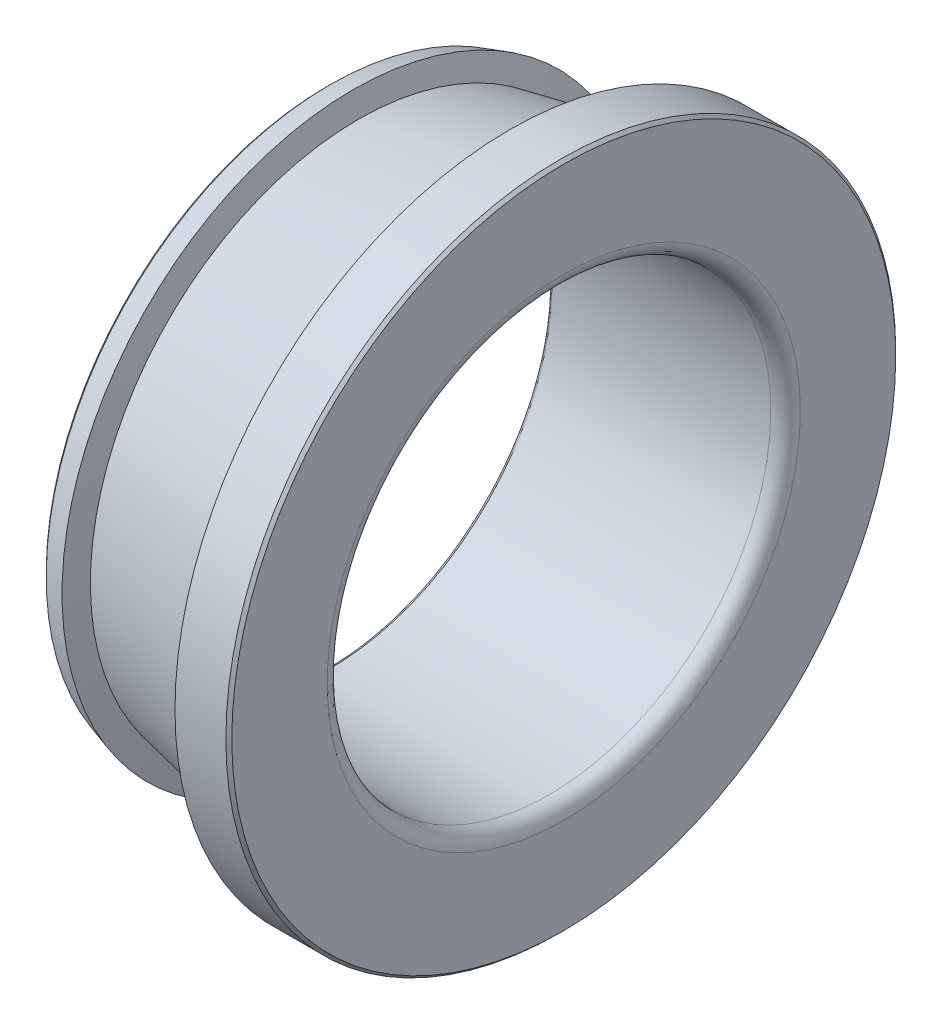
ISO-10303-21;
HEADER;
FILE_DESCRIPTION(('STEP AP214'),'2;1');
FILE_NAME('part.step','',(''),(''),'','','');
FILE_SCHEMA(('AUTOMOTIVE_DESIGN { 1 0 10303 214 1 1 1 1 }'));
ENDSEC;
DATA;
#1=APPLICATION_CONTEXT('core data for automotive mechanical design processes');
#2=APPLICATION_PROTOCOL_DEFINITION('international standard','automotive_design',2000,#1);
#3=PRODUCT_CONTEXT('',#1,'mechanical');
#4=PRODUCT('Part','Part','',(#3));
#5=PRODUCT_RELATED_PRODUCT_CATEGORY('part','',(#4));
#6=PRODUCT_DEFINITION_FORMATION('','',#4);
#7=PRODUCT_DEFINITION_CONTEXT('part definition',#1,'design');
#8=PRODUCT_DEFINITION('design','',#6,#7);
#9=PRODUCT_DEFINITION_SHAPE('','',#8);
#10=(LENGTH_UNIT() NAMED_UNIT(*) SI_UNIT(.MILLI.,.METRE.));
#11=(NAMED_UNIT(*) PLANE_ANGLE_UNIT() SI_UNIT($,.RADIAN.));
#12=(NAMED_UNIT(*) SI_UNIT($,.STERADIAN.) SOLID_ANGLE_UNIT());
#13=UNCERTAINTY_MEASURE_WITH_UNIT(LENGTH_MEASURE(1.E-05),#10,'distance_accuracy_value','');
#14=(GEOMETRIC_REPRESENTATION_CONTEXT(3) GLOBAL_UNCERTAINTY_ASSIGNED_CONTEXT((#13)) GLOBAL_UNIT_ASSIGNED_CONTEXT((#10,
#11,#12)) REPRESENTATION_CONTEXT('',''));
#15=CARTESIAN_POINT('',(0.,0.,0.));
#16=DIRECTION('',(0.,0.,1.));
#17=DIRECTION('',(1.,0.,0.));
#18=AXIS2_PLACEMENT_3D('',#15,#16,#17);
#19=CARTESIAN_POINT('',(7.025,0.,0.));
#20=DIRECTION('',(1.,0.,0.));
#21=DIRECTION('',(0.,1.,0.));
#22=AXIS2_PLACEMENT_3D('',#19,#20,#21);
#23=CONICAL_SURFACE('',#22,20.925,0.300073733433948);
#24=CARTESIAN_POINT('',(1.45,0.,0.));
#25=DIRECTION('',(1.,0.,0.));
#26=DIRECTION('',(0.,1.,0.));
#27=AXIS2_PLACEMENT_3D('',#24,#25,#26);
#28=CIRCLE('',#27,19.2);
#29=CARTESIAN_POINT('',(1.45,19.2,0.));
#30=VERTEX_POINT('',#29);
#31=EDGE_CURVE('E11',#30,#30,#28,.T.);
#32=ORIENTED_EDGE('',*,*,#31,.T.);
#33=EDGE_LOOP('',(#32));
#34=FACE_BOUND('',#33,.T.);
#35=CARTESIAN_POINT('',(3.00035626661439,0.,0.));
#36=DIRECTION('',(-1.,0.,0.));
#37=DIRECTION('',(0.,1.,0.));
#38=AXIS2_PLACEMENT_3D('',#35,#36,#37);
#39=CIRCLE('',#38,19.6797066475174);
#40=CARTESIAN_POINT('',(3.00035626661439,-19.6797066475174,0.));
#41=VERTEX_POINT('',#40);
#42=EDGE_CURVE('E64',#41,#41,#39,.T.);
#43=ORIENTED_EDGE('',*,*,#42,.T.);
#44=EDGE_LOOP('',(#43));
#45=FACE_BOUND('',#44,.T.);
#46=ADVANCED_FACE('F16',(#34,#45),#23,.T.);
#47=CARTESIAN_POINT('',(1.35,0.,0.));
#48=DIRECTION('',(1.,0.,0.));
#49=DIRECTION('',(0.,1.,0.));
#50=AXIS2_PLACEMENT_3D('',#47,#48,#49);
#51=CONICAL_SURFACE('',#50,19.1,0.785398163397446);
#52=CARTESIAN_POINT('',(1.25,0.,0.));
#53=DIRECTION('',(1.,0.,0.));
#54=DIRECTION('',(0.,1.,0.));
#55=AXIS2_PLACEMENT_3D('',#52,#53,#54);
#56=CIRCLE('',#55,19.);
#57=CARTESIAN_POINT('',(1.25,19.,0.));
#58=VERTEX_POINT('',#57);
#59=EDGE_CURVE('E19',#58,#58,#56,.T.);
#60=ORIENTED_EDGE('',*,*,#59,.T.);
#61=EDGE_LOOP('',(#60));
#62=FACE_BOUND('',#61,.T.);
#63=ORIENTED_EDGE('',*,*,#31,.F.);
#64=EDGE_LOOP('',(#63));
#65=FACE_BOUND('',#64,.T.);
#66=ADVANCED_FACE('F107',(#62,#65),#51,.T.);
#67=CARTESIAN_POINT('',(1.25,17.1,0.));
#68=DIRECTION('',(-1.,0.,0.));
#69=DIRECTION('',(0.,-1.,0.));
#70=AXIS2_PLACEMENT_3D('',#67,#68,#69);
#71=PLANE('',#70);
#72=CARTESIAN_POINT('',(1.25,0.,0.));
#73=DIRECTION('',(1.,0.,0.));
#74=DIRECTION('',(0.,1.,0.));
#75=AXIS2_PLACEMENT_3D('',#72,#73,#74);
#76=CIRCLE('',#75,15.2);
#77=CARTESIAN_POINT('',(1.25,15.2,0.));
#78=VERTEX_POINT('',#77);
#79=EDGE_CURVE('E48',#78,#78,#76,.T.);
#80=ORIENTED_EDGE('',*,*,#79,.T.);
#81=EDGE_LOOP('',(#80));
#82=FACE_BOUND('',#81,.T.);
#83=ORIENTED_EDGE('',*,*,#59,.F.);
#84=EDGE_LOOP('',(#83));
#85=FACE_BOUND('',#84,.T.);
#86=ADVANCED_FACE('F111',(#82,#85),#71,.T.);
#87=CARTESIAN_POINT('',(1.45,0.,0.));
#88=DIRECTION('',(1.,0.,0.));
#89=DIRECTION('',(0.,0.,-1.));
#90=AXIS2_PLACEMENT_3D('',#87,#88,#89);
#91=TOROIDAL_SURFACE('',#90,15.2,0.2);
#92=CARTESIAN_POINT('',(1.45,0.,0.));
#93=DIRECTION('',(1.,0.,0.));
#94=DIRECTION('',(0.,1.,0.));
#95=AXIS2_PLACEMENT_3D('',#92,#93,#94);
#96=CIRCLE('',#95,15.);
#97=CARTESIAN_POINT('',(1.45,15.,0.));
#98=VERTEX_POINT('',#97);
#99=EDGE_CURVE('E53',#98,#98,#96,.T.);
#100=ORIENTED_EDGE('',*,*,#99,.T.);
#101=EDGE_LOOP('',(#100));
#102=FACE_BOUND('',#101,.T.);
#103=ORIENTED_EDGE('',*,*,#79,.F.);
#104=EDGE_LOOP('',(#103));
#105=FACE_BOUND('',#104,.T.);
#106=ADVANCED_FACE('F116',(#102,#105),#91,.T.);
#107=CARTESIAN_POINT('',(8.85,0.,0.));
#108=DIRECTION('',(-1.,0.,0.));
#109=DIRECTION('',(0.,1.,0.));
#110=AXIS2_PLACEMENT_3D('',#107,#108,#109);
#111=CYLINDRICAL_SURFACE('',#110,15.);
#112=CARTESIAN_POINT('',(16.25,0.,0.));
#113=DIRECTION('',(1.,0.,0.));
#114=DIRECTION('',(0.,1.,0.));
#115=AXIS2_PLACEMENT_3D('',#112,#113,#114);
#116=CIRCLE('',#115,15.);
#117=CARTESIAN_POINT('',(16.25,15.,0.));
#118=VERTEX_POINT('',#117);
#119=EDGE_CURVE('E81',#118,#118,#116,.T.);
#120=ORIENTED_EDGE('',*,*,#119,.T.);
#121=EDGE_LOOP('',(#120));
#122=FACE_BOUND('',#121,.T.);
#123=ORIENTED_EDGE('',*,*,#99,.F.);
#124=EDGE_LOOP('',(#123));
#125=FACE_BOUND('',#124,.T.);
#126=ADVANCED_FACE('F122',(#122,#125),#111,.F.);
#127=CARTESIAN_POINT('',(16.25,0.,0.));
#128=DIRECTION('',(1.,0.,0.));
#129=DIRECTION('',(0.,0.,-1.));
#130=AXIS2_PLACEMENT_3D('',#127,#128,#129);
#131=TOROIDAL_SURFACE('',#130,16.,1.);
#132=CARTESIAN_POINT('',(17.25,0.,0.));
#133=DIRECTION('',(1.,0.,0.));
#134=DIRECTION('',(0.,1.,0.));
#135=AXIS2_PLACEMENT_3D('',#132,#133,#134);
#136=CIRCLE('',#135,16.);
#137=CARTESIAN_POINT('',(17.25,16.,0.));
#138=VERTEX_POINT('',#137);
#139=EDGE_CURVE('E79',#138,#138,#136,.T.);
#140=ORIENTED_EDGE('',*,*,#139,.T.);
#141=EDGE_LOOP('',(#140));
#142=FACE_BOUND('',#141,.T.);
#143=ORIENTED_EDGE('',*,*,#119,.F.);
#144=EDGE_LOOP('',(#143));
#145=FACE_BOUND('',#144,.T.);
#146=ADVANCED_FACE('F125',(#142,#145),#131,.T.);
#147=CARTESIAN_POINT('',(17.25,19.225,0.));
#148=DIRECTION('',(1.,0.,0.));
#149=DIRECTION('',(0.,1.,0.));
#150=AXIS2_PLACEMENT_3D('',#147,#148,#149);
#151=PLANE('',#150);
#152=CARTESIAN_POINT('',(17.25,0.,0.));
#153=DIRECTION('',(1.,0.,0.));
#154=DIRECTION('',(0.,1.,0.));
#155=AXIS2_PLACEMENT_3D('',#152,#153,#154);
#156=CIRCLE('',#155,22.45);
#157=CARTESIAN_POINT('',(17.25,22.45,0.));
#158=VERTEX_POINT('',#157);
#159=EDGE_CURVE('E73',#158,#158,#156,.T.);
#160=ORIENTED_EDGE('',*,*,#159,.T.);
#161=EDGE_LOOP('',(#160));
#162=FACE_BOUND('',#161,.T.);
#163=ORIENTED_EDGE('',*,*,#139,.F.);
#164=EDGE_LOOP('',(#163));
#165=FACE_BOUND('',#164,.T.);
#166=ADVANCED_FACE('F129',(#162,#165),#151,.T.);
#167=CARTESIAN_POINT('',(17.15,0.,0.));
#168=DIRECTION('',(-1.,0.,0.));
#169=DIRECTION('',(0.,1.,0.));
#170=AXIS2_PLACEMENT_3D('',#167,#168,#169);
#171=CONICAL_SURFACE('',#170,22.55,0.785398163397448);
#172=CARTESIAN_POINT('',(17.05,0.,0.));
#173=DIRECTION('',(1.,0.,0.));
#174=DIRECTION('',(0.,1.,0.));
#175=AXIS2_PLACEMENT_3D('',#172,#173,#174);
#176=CIRCLE('',#175,22.65);
#177=CARTESIAN_POINT('',(17.05,22.65,0.));
#178=VERTEX_POINT('',#177);
#179=EDGE_CURVE('E71',#178,#178,#176,.T.);
#180=ORIENTED_EDGE('',*,*,#179,.T.);
#181=EDGE_LOOP('',(#180));
#182=FACE_BOUND('',#181,.T.);
#183=ORIENTED_EDGE('',*,*,#159,.F.);
#184=EDGE_LOOP('',(#183));
#185=FACE_BOUND('',#184,.T.);
#186=ADVANCED_FACE('F133',(#182,#185),#171,.T.);
#187=CARTESIAN_POINT('',(14.825,0.,0.));
#188=DIRECTION('',(-1.,0.,0.));
#189=DIRECTION('',(0.,1.,0.));
#190=AXIS2_PLACEMENT_3D('',#187,#188,#189);
#191=CYLINDRICAL_SURFACE('',#190,22.65);
#192=ORIENTED_EDGE('',*,*,#179,.F.);
#193=EDGE_LOOP('',(#192));
#194=FACE_BOUND('',#193,.T.);
#195=CARTESIAN_POINT('',(13.6075330295687,0.,0.));
#196=DIRECTION('',(1.,0.,0.));
#197=DIRECTION('',(0.,1.,0.));
#198=AXIS2_PLACEMENT_3D('',#195,#196,#197);
#199=CIRCLE('',#198,22.65);
#200=CARTESIAN_POINT('',(13.6075330295687,-22.65,0.));
#201=VERTEX_POINT('',#200);
#202=EDGE_CURVE('E68',#201,#201,#199,.T.);
#203=ORIENTED_EDGE('',*,*,#202,.T.);
#204=EDGE_LOOP('',(#203));
#205=FACE_BOUND('',#204,.T.);
#206=ADVANCED_FACE('F69',(#194,#205),#191,.T.);
#207=CARTESIAN_POINT('',(13.2555917900464,0.,0.));
#208=DIRECTION('',(-1.,0.,0.));
#209=DIRECTION('',(0.,1.,0.));
#210=AXIS2_PLACEMENT_3D('',#207,#208,#209);
#211=CONICAL_SURFACE('',#210,24.2203229092885,1.35031935436597);
#212=CARTESIAN_POINT('',(14.1434937921758,0.,0.));
#213=DIRECTION('',(1.,0.,0.));
#214=DIRECTION('',(0.,1.,0.));
#215=AXIS2_PLACEMENT_3D('',#212,#213,#214);
#216=CIRCLE('',#215,20.2586023191138);
#217=CARTESIAN_POINT('',(14.1434937921758,20.2586023191138,0.));
#218=VERTEX_POINT('',#217);
#219=EDGE_CURVE('E75',#218,#218,#216,.T.);
#220=ORIENTED_EDGE('',*,*,#219,.T.);
#221=EDGE_LOOP('',(#220));
#222=FACE_BOUND('',#221,.T.);
#223=ORIENTED_EDGE('',*,*,#202,.F.);
#224=EDGE_LOOP('',(#223));
#225=FACE_BOUND('',#224,.T.);
#226=ADVANCED_FACE('F96',(#222,#225),#211,.F.);
#227=CARTESIAN_POINT('',(2.52186605311972,0.,0.));
#228=DIRECTION('',(-1.,0.,0.));
#229=DIRECTION('',(0.,1.,0.));
#230=AXIS2_PLACEMENT_3D('',#227,#228,#229);
#231=CONICAL_SURFACE('',#230,21.8146770907114,1.35031935436597);
#232=CARTESIAN_POINT('',(3.35082409611266,0.,0.));
#233=DIRECTION('',(1.,0.,0.));
#234=DIRECTION('',(0.,1.,0.));
#235=AXIS2_PLACEMENT_3D('',#232,#233,#234);
#236=CIRCLE('',#235,18.1159579308941);
#237=CARTESIAN_POINT('',(3.35082409611266,18.1159579308941,0.));
#238=VERTEX_POINT('',#237);
#239=EDGE_CURVE('E84',#238,#238,#236,.T.);
#240=ORIENTED_EDGE('',*,*,#239,.F.);
#241=EDGE_LOOP('',(#240));
#242=FACE_BOUND('',#241,.T.);
#243=ORIENTED_EDGE('',*,*,#42,.F.);
#244=EDGE_LOOP('',(#243));
#245=FACE_BOUND('',#244,.T.);
#246=ADVANCED_FACE('F93',(#242,#245),#231,.T.);
#247=CARTESIAN_POINT('',(8.74715894414422,0.,0.));
#248=DIRECTION('',(1.,0.,0.));
#249=DIRECTION('',(0.,1.,0.));
#250=AXIS2_PLACEMENT_3D('',#247,#248,#249);
#251=CONICAL_SURFACE('',#250,19.1872801250039,0.19597953104794);
#252=ORIENTED_EDGE('',*,*,#219,.F.);
#253=EDGE_LOOP('',(#252));
#254=FACE_BOUND('',#253,.T.);
#255=ORIENTED_EDGE('',*,*,#239,.T.);
#256=EDGE_LOOP('',(#255));
#257=FACE_BOUND('',#256,.T.);
#258=ADVANCED_FACE('F91',(#254,#257),#251,.T.);
#259=CLOSED_SHELL('',(#46,#66,#86,#106,#126,#146,#166,#186,#206,#226,#246,#258));
#260=MANIFOLD_SOLID_BREP('B1',#259);
#261=ADVANCED_BREP_SHAPE_REPRESENTATION('',(#18,#260),#14);
#262=SHAPE_DEFINITION_REPRESENTATION(#9,#261);
ENDSEC;
END-ISO-10303-21;
